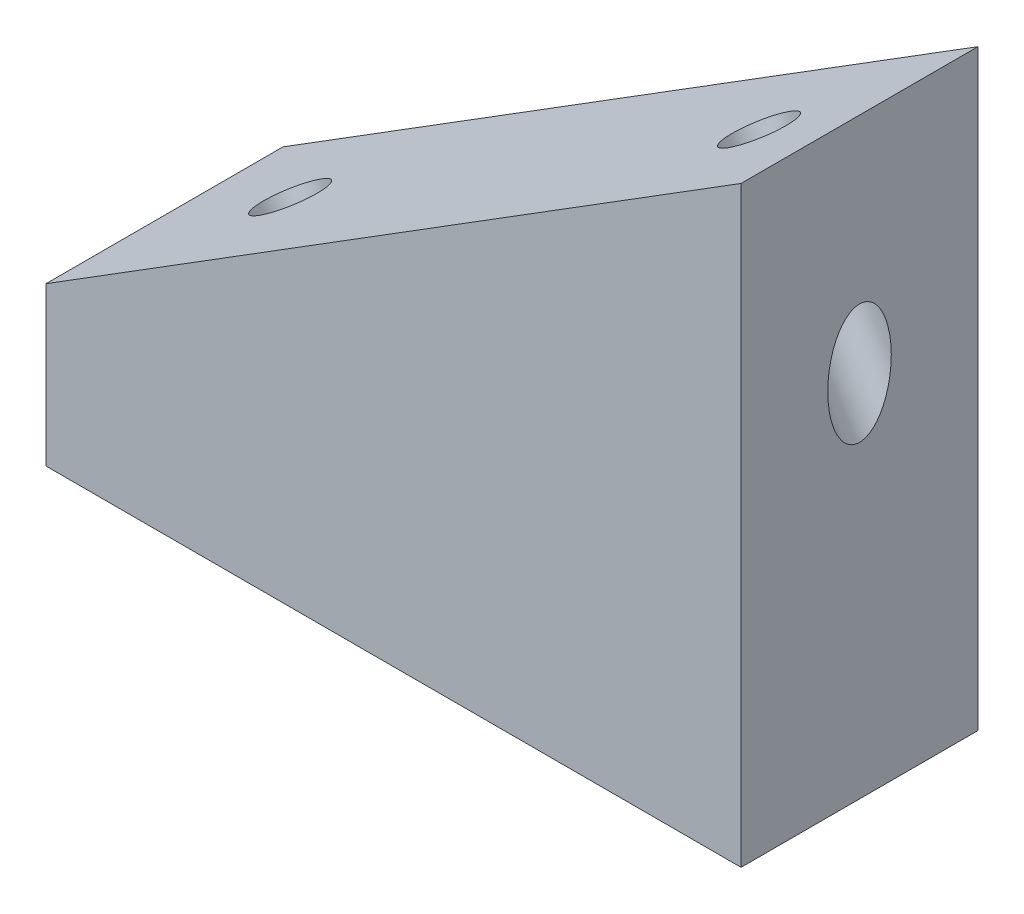
ISO-10303-21;
HEADER;
FILE_DESCRIPTION(('STEP AP214'),'2;1');
FILE_NAME('part.step','',(''),(''),'','','');
FILE_SCHEMA(('AUTOMOTIVE_DESIGN { 1 0 10303 214 1 1 1 1 }'));
ENDSEC;
DATA;
#1=APPLICATION_CONTEXT('core data for automotive mechanical design processes');
#2=APPLICATION_PROTOCOL_DEFINITION('international standard','automotive_design',2000,#1);
#3=PRODUCT_CONTEXT('',#1,'mechanical');
#4=PRODUCT('Part','Part','',(#3));
#5=PRODUCT_RELATED_PRODUCT_CATEGORY('part','',(#4));
#6=PRODUCT_DEFINITION_FORMATION('','',#4);
#7=PRODUCT_DEFINITION_CONTEXT('part definition',#1,'design');
#8=PRODUCT_DEFINITION('design','',#6,#7);
#9=PRODUCT_DEFINITION_SHAPE('','',#8);
#10=(LENGTH_UNIT() NAMED_UNIT(*) SI_UNIT(.MILLI.,.METRE.));
#11=(NAMED_UNIT(*) PLANE_ANGLE_UNIT() SI_UNIT($,.RADIAN.));
#12=(NAMED_UNIT(*) SI_UNIT($,.STERADIAN.) SOLID_ANGLE_UNIT());
#13=UNCERTAINTY_MEASURE_WITH_UNIT(LENGTH_MEASURE(1.E-05),#10,'distance_accuracy_value','');
#14=(GEOMETRIC_REPRESENTATION_CONTEXT(3) GLOBAL_UNCERTAINTY_ASSIGNED_CONTEXT((#13)) GLOBAL_UNIT_ASSIGNED_CONTEXT((#10,
#11,#12)) REPRESENTATION_CONTEXT('',''));
#15=CARTESIAN_POINT('',(0.,0.,0.));
#16=DIRECTION('',(0.,0.,1.));
#17=DIRECTION('',(1.,0.,0.));
#18=AXIS2_PLACEMENT_3D('',#15,#16,#17);
#19=CARTESIAN_POINT('',(0.,0.,19.05));
#20=DIRECTION('',(-1.,0.,0.));
#21=DIRECTION('',(0.,0.,1.));
#22=AXIS2_PLACEMENT_3D('',#19,#20,#21);
#23=PLANE('',#22);
#24=CARTESIAN_POINT('',(0.,29.6432631962236,9.525));
#25=DIRECTION('',(-1.,0.,0.));
#26=DIRECTION('',(0.,1.,0.));
#27=AXIS2_PLACEMENT_3D('',#24,#25,#26);
#28=ELLIPSE('',#27,4.81714889850965,2.55269999999999);
#29=CARTESIAN_POINT('',(0.,34.4604120947333,9.525));
#30=VERTEX_POINT('',#29);
#31=EDGE_CURVE('E105',#30,#30,#28,.T.);
#32=ORIENTED_EDGE('',*,*,#31,.T.);
#33=EDGE_LOOP('',(#32));
#34=FACE_BOUND('',#33,.T.);
#35=DIRECTION('',(0.,1.,0.));
#36=VECTOR('',#35,1.);
#37=CARTESIAN_POINT('',(0.,0.,0.));
#38=LINE('',#37,#36);
#39=CARTESIAN_POINT('',(0.,0.,0.));
#40=VERTEX_POINT('',#39);
#41=CARTESIAN_POINT('',(0.,47.6176993846925,0.));
#42=VERTEX_POINT('',#41);
#43=EDGE_CURVE('E102',#40,#42,#38,.T.);
#44=ORIENTED_EDGE('',*,*,#43,.T.);
#45=DIRECTION('',(0.,0.,-1.));
#46=VECTOR('',#45,1.);
#47=CARTESIAN_POINT('',(0.,47.6176993846925,19.05));
#48=LINE('',#47,#46);
#49=CARTESIAN_POINT('',(0.,47.6176993846925,19.05));
#50=VERTEX_POINT('',#49);
#51=EDGE_CURVE('E11',#50,#42,#48,.T.);
#52=ORIENTED_EDGE('',*,*,#51,.F.);
#53=DIRECTION('',(0.,1.,0.));
#54=VECTOR('',#53,1.);
#55=CARTESIAN_POINT('',(0.,0.,19.05));
#56=LINE('',#55,#54);
#57=CARTESIAN_POINT('',(0.,0.,19.05));
#58=VERTEX_POINT('',#57);
#59=EDGE_CURVE('E90',#58,#50,#56,.T.);
#60=ORIENTED_EDGE('',*,*,#59,.F.);
#61=DIRECTION('',(0.,0.,-1.));
#62=VECTOR('',#61,1.);
#63=CARTESIAN_POINT('',(0.,0.,19.05));
#64=LINE('',#63,#62);
#65=EDGE_CURVE('E98',#58,#40,#64,.T.);
#66=ORIENTED_EDGE('',*,*,#65,.T.);
#67=EDGE_LOOP('',(#44,#52,#60,#66));
#68=FACE_BOUND('',#67,.T.);
#69=ADVANCED_FACE('F39',(#34,#68),#23,.F.);
#70=CARTESIAN_POINT('',(0.,47.6176993846925,19.05));
#71=DIRECTION('',(0.529919264233197,-0.848048096156431,0.));
#72=DIRECTION('',(0.848048096156431,0.529919264233197,0.));
#73=AXIS2_PLACEMENT_3D('',#70,#71,#72);
#74=PLANE('',#73);
#75=CARTESIAN_POINT('',(-45.7733959900433,19.0153070977057,9.52500000000001));
#76=DIRECTION('',(-0.529919264233197,0.848048096156431,0.));
#77=DIRECTION('',(-0.848048096156431,-0.529919264233197,0.));
#78=AXIS2_PLACEMENT_3D('',#75,#76,#77);
#79=CIRCLE('',#78,2.55269999999999);
#80=CARTESIAN_POINT('',(-47.9382083651019,17.6625821918976,9.52500000000001));
#81=VERTEX_POINT('',#80);
#82=EDGE_CURVE('E124',#81,#81,#79,.T.);
#83=ORIENTED_EDGE('',*,*,#82,.F.);
#84=EDGE_LOOP('',(#83));
#85=FACE_BOUND('',#84,.T.);
#86=CARTESIAN_POINT('',(-8.07765811589001,42.5702183928713,9.525));
#87=DIRECTION('',(-0.529919264233197,0.848048096156431,0.));
#88=DIRECTION('',(-0.848048096156431,-0.529919264233197,0.));
#89=AXIS2_PLACEMENT_3D('',#86,#87,#88);
#90=CIRCLE('',#89,2.55269999999999);
#91=CARTESIAN_POINT('',(-10.2424704909485,41.2174934870633,9.525));
#92=VERTEX_POINT('',#91);
#93=EDGE_CURVE('E118',#92,#92,#90,.T.);
#94=ORIENTED_EDGE('',*,*,#93,.F.);
#95=EDGE_LOOP('',(#94));
#96=FACE_BOUND('',#95,.T.);
#97=DIRECTION('',(-0.848048096156431,-0.529919264233198,0.));
#98=VECTOR('',#97,1.);
#99=CARTESIAN_POINT('',(0.,47.6176993846925,0.));
#100=LINE('',#99,#98);
#101=CARTESIAN_POINT('',(-55.88,12.7,0.));
#102=VERTEX_POINT('',#101);
#103=EDGE_CURVE('E94',#42,#102,#100,.T.);
#104=ORIENTED_EDGE('',*,*,#103,.T.);
#105=DIRECTION('',(0.,0.,-1.));
#106=VECTOR('',#105,1.);
#107=CARTESIAN_POINT('',(-55.88,12.7,19.05));
#108=LINE('',#107,#106);
#109=CARTESIAN_POINT('',(-55.88,12.7,19.05));
#110=VERTEX_POINT('',#109);
#111=EDGE_CURVE('E47',#110,#102,#108,.T.);
#112=ORIENTED_EDGE('',*,*,#111,.F.);
#113=DIRECTION('',(-0.848048096156431,-0.529919264233198,0.));
#114=VECTOR('',#113,1.);
#115=CARTESIAN_POINT('',(0.,47.6176993846925,19.05));
#116=LINE('',#115,#114);
#117=EDGE_CURVE('E85',#50,#110,#116,.T.);
#118=ORIENTED_EDGE('',*,*,#117,.F.);
#119=ORIENTED_EDGE('',*,*,#51,.T.);
#120=EDGE_LOOP('',(#104,#112,#118,#119));
#121=FACE_BOUND('',#120,.T.);
#122=ADVANCED_FACE('F93',(#85,#96,#121),#74,.F.);
#123=CARTESIAN_POINT('',(-55.88,12.7,19.05));
#124=DIRECTION('',(1.,0.,0.));
#125=DIRECTION('',(0.,1.,0.));
#126=AXIS2_PLACEMENT_3D('',#123,#124,#125);
#127=PLANE('',#126);
#128=DIRECTION('',(0.,-1.,0.));
#129=VECTOR('',#128,1.);
#130=CARTESIAN_POINT('',(-55.88,12.7,0.));
#131=LINE('',#130,#129);
#132=CARTESIAN_POINT('',(-55.88,0.,0.));
#133=VERTEX_POINT('',#132);
#134=EDGE_CURVE('E72',#102,#133,#131,.T.);
#135=ORIENTED_EDGE('',*,*,#134,.T.);
#136=DIRECTION('',(0.,0.,-1.));
#137=VECTOR('',#136,1.);
#138=CARTESIAN_POINT('',(-55.88,0.,19.05));
#139=LINE('',#138,#137);
#140=CARTESIAN_POINT('',(-55.88,0.,19.05));
#141=VERTEX_POINT('',#140);
#142=EDGE_CURVE('E95',#141,#133,#139,.T.);
#143=ORIENTED_EDGE('',*,*,#142,.F.);
#144=DIRECTION('',(0.,-1.,0.));
#145=VECTOR('',#144,1.);
#146=CARTESIAN_POINT('',(-55.88,12.7,19.05));
#147=LINE('',#146,#145);
#148=EDGE_CURVE('E88',#110,#141,#147,.T.);
#149=ORIENTED_EDGE('',*,*,#148,.F.);
#150=ORIENTED_EDGE('',*,*,#111,.T.);
#151=EDGE_LOOP('',(#135,#143,#149,#150));
#152=FACE_BOUND('',#151,.T.);
#153=ADVANCED_FACE('F96',(#152),#127,.F.);
#154=CARTESIAN_POINT('',(-55.88,0.,19.05));
#155=DIRECTION('',(0.,1.,0.));
#156=DIRECTION('',(0.,0.,1.));
#157=AXIS2_PLACEMENT_3D('',#154,#155,#156);
#158=PLANE('',#157);
#159=CARTESIAN_POINT('',(-33.8913133675434,0.,9.52500000000001));
#160=DIRECTION('',(0.,1.,0.));
#161=DIRECTION('',(-1.,0.,0.));
#162=AXIS2_PLACEMENT_3D('',#159,#160,#161);
#163=ELLIPSE('',#162,3.0100887102624,2.55269999999999);
#164=CARTESIAN_POINT('',(-36.9014020778058,0.,9.52500000000001));
#165=VERTEX_POINT('',#164);
#166=EDGE_CURVE('E121',#165,#165,#163,.T.);
#167=ORIENTED_EDGE('',*,*,#166,.T.);
#168=EDGE_LOOP('',(#167));
#169=FACE_BOUND('',#168,.T.);
#170=DIRECTION('',(1.,0.,0.));
#171=VECTOR('',#170,1.);
#172=CARTESIAN_POINT('',(-55.88,0.,0.));
#173=LINE('',#172,#171);
#174=EDGE_CURVE('E78',#133,#40,#173,.T.);
#175=ORIENTED_EDGE('',*,*,#174,.T.);
#176=ORIENTED_EDGE('',*,*,#65,.F.);
#177=DIRECTION('',(1.,0.,0.));
#178=VECTOR('',#177,1.);
#179=CARTESIAN_POINT('',(-55.88,0.,19.05));
#180=LINE('',#179,#178);
#181=EDGE_CURVE('E55',#141,#58,#180,.T.);
#182=ORIENTED_EDGE('',*,*,#181,.F.);
#183=ORIENTED_EDGE('',*,*,#142,.T.);
#184=EDGE_LOOP('',(#175,#176,#182,#183));
#185=FACE_BOUND('',#184,.T.);
#186=ADVANCED_FACE('F110',(#169,#185),#158,.F.);
#187=CARTESIAN_POINT('',(0.,0.,19.05));
#188=DIRECTION('',(0.,0.,-1.));
#189=DIRECTION('',(-1.,0.,0.));
#190=AXIS2_PLACEMENT_3D('',#187,#188,#189);
#191=PLANE('',#190);
#192=ORIENTED_EDGE('',*,*,#59,.T.);
#193=ORIENTED_EDGE('',*,*,#117,.T.);
#194=ORIENTED_EDGE('',*,*,#148,.T.);
#195=ORIENTED_EDGE('',*,*,#181,.T.);
#196=EDGE_LOOP('',(#192,#193,#194,#195));
#197=FACE_BOUND('',#196,.T.);
#198=ADVANCED_FACE('F86',(#197),#191,.F.);
#199=CARTESIAN_POINT('',(0.,0.,0.));
#200=DIRECTION('',(0.,0.,-1.));
#201=DIRECTION('',(-1.,0.,0.));
#202=AXIS2_PLACEMENT_3D('',#199,#200,#201);
#203=PLANE('',#202);
#204=ORIENTED_EDGE('',*,*,#43,.F.);
#205=ORIENTED_EDGE('',*,*,#174,.F.);
#206=ORIENTED_EDGE('',*,*,#134,.F.);
#207=ORIENTED_EDGE('',*,*,#103,.F.);
#208=EDGE_LOOP('',(#204,#205,#206,#207));
#209=FACE_BOUND('',#208,.T.);
#210=ADVANCED_FACE('F113',(#209),#203,.T.);
#211=CARTESIAN_POINT('',(-8.07765811589001,42.5702183928713,9.525));
#212=DIRECTION('',(-0.529919264233197,0.848048096156431,0.));
#213=DIRECTION('',(-0.848048096156431,-0.529919264233197,0.));
#214=AXIS2_PLACEMENT_3D('',#211,#212,#213);
#215=CYLINDRICAL_SURFACE('',#214,2.55269999999999);
#216=ORIENTED_EDGE('',*,*,#93,.T.);
#217=EDGE_LOOP('',(#216));
#218=FACE_BOUND('',#217,.T.);
#219=ORIENTED_EDGE('',*,*,#31,.F.);
#220=EDGE_LOOP('',(#219));
#221=FACE_BOUND('',#220,.T.);
#222=ADVANCED_FACE('F135',(#218,#221),#215,.F.);
#223=CARTESIAN_POINT('',(-45.7733959900433,19.0153070977057,9.52500000000001));
#224=DIRECTION('',(-0.529919264233197,0.848048096156431,0.));
#225=DIRECTION('',(-0.848048096156431,-0.529919264233197,0.));
#226=AXIS2_PLACEMENT_3D('',#223,#224,#225);
#227=CYLINDRICAL_SURFACE('',#226,2.55269999999999);
#228=ORIENTED_EDGE('',*,*,#82,.T.);
#229=EDGE_LOOP('',(#228));
#230=FACE_BOUND('',#229,.T.);
#231=ORIENTED_EDGE('',*,*,#166,.F.);
#232=EDGE_LOOP('',(#231));
#233=FACE_BOUND('',#232,.T.);
#234=ADVANCED_FACE('F128',(#230,#233),#227,.F.);
#235=CLOSED_SHELL('',(#69,#122,#153,#186,#198,#210,#222,#234));
#236=MANIFOLD_SOLID_BREP('B2',#235);
#237=ADVANCED_BREP_SHAPE_REPRESENTATION('',(#18,#236),#14);
#238=SHAPE_DEFINITION_REPRESENTATION(#9,#237);
ENDSEC;
END-ISO-10303-21;
